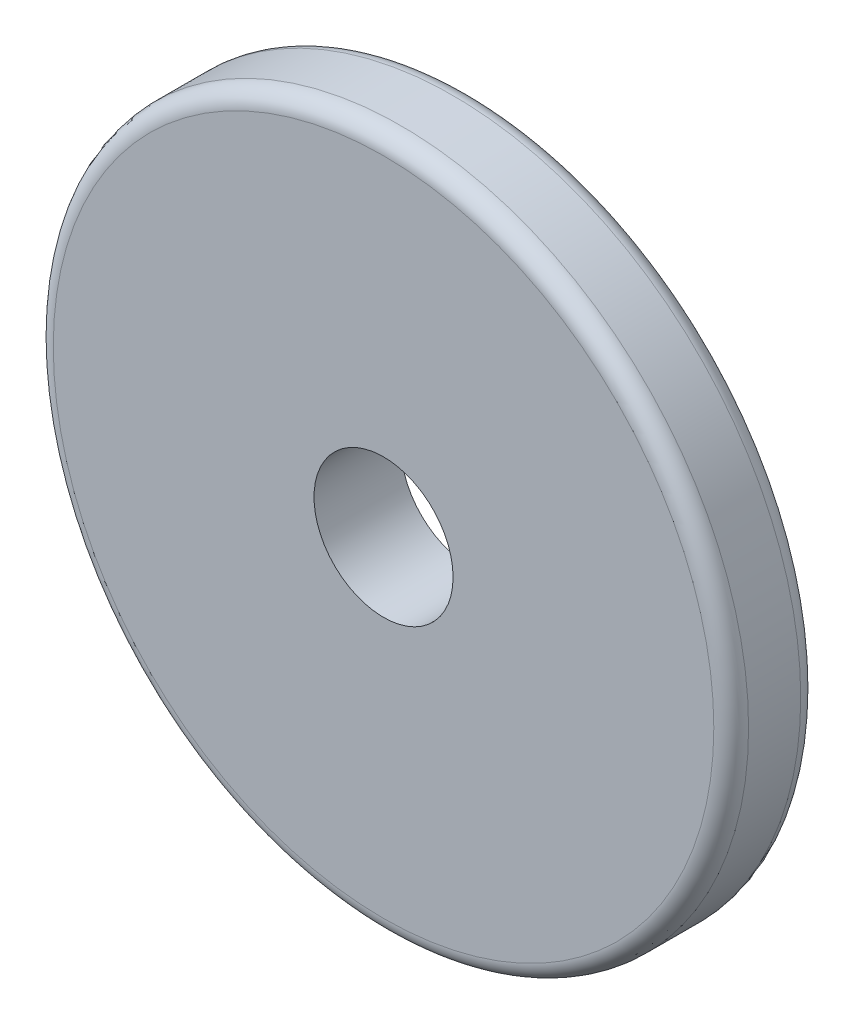
ISO-10303-21;
HEADER;
FILE_DESCRIPTION(('STEP AP214'),'2;1');
FILE_NAME('part.step','',(''),(''),'','','');
FILE_SCHEMA(('AUTOMOTIVE_DESIGN { 1 0 10303 214 1 1 1 1 }'));
ENDSEC;
DATA;
#1=APPLICATION_CONTEXT('core data for automotive mechanical design processes');
#2=APPLICATION_PROTOCOL_DEFINITION('international standard','automotive_design',2000,#1);
#3=PRODUCT_CONTEXT('',#1,'mechanical');
#4=PRODUCT('Part','Part','',(#3));
#5=PRODUCT_RELATED_PRODUCT_CATEGORY('part','',(#4));
#6=PRODUCT_DEFINITION_FORMATION('','',#4);
#7=PRODUCT_DEFINITION_CONTEXT('part definition',#1,'design');
#8=PRODUCT_DEFINITION('design','',#6,#7);
#9=PRODUCT_DEFINITION_SHAPE('','',#8);
#10=(LENGTH_UNIT() NAMED_UNIT(*) SI_UNIT(.MILLI.,.METRE.));
#11=(NAMED_UNIT(*) PLANE_ANGLE_UNIT() SI_UNIT($,.RADIAN.));
#12=(NAMED_UNIT(*) SI_UNIT($,.STERADIAN.) SOLID_ANGLE_UNIT());
#13=UNCERTAINTY_MEASURE_WITH_UNIT(LENGTH_MEASURE(1.E-05),#10,'distance_accuracy_value','');
#14=(GEOMETRIC_REPRESENTATION_CONTEXT(3) GLOBAL_UNCERTAINTY_ASSIGNED_CONTEXT((#13)) GLOBAL_UNIT_ASSIGNED_CONTEXT((#10,
#11,#12)) REPRESENTATION_CONTEXT('',''));
#15=CARTESIAN_POINT('',(0.,0.,0.));
#16=DIRECTION('',(0.,0.,1.));
#17=DIRECTION('',(1.,0.,0.));
#18=AXIS2_PLACEMENT_3D('',#15,#16,#17);
#19=CARTESIAN_POINT('',(0.,0.,5.));
#20=DIRECTION('',(0.,0.,1.));
#21=DIRECTION('',(1.,0.,0.));
#22=AXIS2_PLACEMENT_3D('',#19,#20,#21);
#23=PLANE('',#22);
#24=CARTESIAN_POINT('',(0.,0.,5.));
#25=DIRECTION('',(0.,0.,1.));
#26=DIRECTION('',(1.,0.,0.));
#27=AXIS2_PLACEMENT_3D('',#24,#25,#26);
#28=CIRCLE('',#27,19.);
#29=CARTESIAN_POINT('',(19.,0.,5.));
#30=VERTEX_POINT('',#29);
#31=EDGE_CURVE('E46',#30,#30,#28,.T.);
#32=ORIENTED_EDGE('',*,*,#31,.T.);
#33=EDGE_LOOP('',(#32));
#34=FACE_BOUND('',#33,.T.);
#35=CARTESIAN_POINT('',(0.,0.,5.));
#36=DIRECTION('',(0.,0.,1.));
#37=DIRECTION('',(1.,0.,0.));
#38=AXIS2_PLACEMENT_3D('',#35,#36,#37);
#39=CIRCLE('',#38,4.);
#40=CARTESIAN_POINT('',(4.,0.,5.));
#41=VERTEX_POINT('',#40);
#42=EDGE_CURVE('E51',#41,#41,#39,.T.);
#43=ORIENTED_EDGE('',*,*,#42,.F.);
#44=EDGE_LOOP('',(#43));
#45=FACE_BOUND('',#44,.T.);
#46=ADVANCED_FACE('F31',(#34,#45),#23,.T.);
#47=CARTESIAN_POINT('',(0.,0.,0.));
#48=DIRECTION('',(0.,0.,1.));
#49=DIRECTION('',(1.,0.,0.));
#50=AXIS2_PLACEMENT_3D('',#47,#48,#49);
#51=PLANE('',#50);
#52=CARTESIAN_POINT('',(0.,0.,0.));
#53=DIRECTION('',(0.,0.,1.));
#54=DIRECTION('',(1.,0.,0.));
#55=AXIS2_PLACEMENT_3D('',#52,#53,#54);
#56=CIRCLE('',#55,19.);
#57=CARTESIAN_POINT('',(19.,0.,0.));
#58=VERTEX_POINT('',#57);
#59=EDGE_CURVE('E10',#58,#58,#56,.F.);
#60=ORIENTED_EDGE('',*,*,#59,.T.);
#61=EDGE_LOOP('',(#60));
#62=FACE_BOUND('',#61,.T.);
#63=CARTESIAN_POINT('',(0.,0.,0.));
#64=DIRECTION('',(0.,0.,1.));
#65=DIRECTION('',(1.,0.,0.));
#66=AXIS2_PLACEMENT_3D('',#63,#64,#65);
#67=CIRCLE('',#66,4.);
#68=CARTESIAN_POINT('',(4.,0.,0.));
#69=VERTEX_POINT('',#68);
#70=EDGE_CURVE('E52',#69,#69,#67,.T.);
#71=ORIENTED_EDGE('',*,*,#70,.T.);
#72=EDGE_LOOP('',(#71));
#73=FACE_BOUND('',#72,.T.);
#74=ADVANCED_FACE('F62',(#62,#73),#51,.F.);
#75=CARTESIAN_POINT('',(0.,0.,5.));
#76=DIRECTION('',(0.,0.,-1.));
#77=DIRECTION('',(-1.,0.,0.));
#78=AXIS2_PLACEMENT_3D('',#75,#76,#77);
#79=CYLINDRICAL_SURFACE('',#78,20.);
#80=CARTESIAN_POINT('',(0.,0.,4.));
#81=DIRECTION('',(0.,0.,1.));
#82=DIRECTION('',(1.,0.,0.));
#83=AXIS2_PLACEMENT_3D('',#80,#81,#82);
#84=CIRCLE('',#83,20.);
#85=CARTESIAN_POINT('',(20.,0.,4.));
#86=VERTEX_POINT('',#85);
#87=EDGE_CURVE('E38',#86,#86,#84,.F.);
#88=ORIENTED_EDGE('',*,*,#87,.T.);
#89=EDGE_LOOP('',(#88));
#90=FACE_BOUND('',#89,.T.);
#91=CARTESIAN_POINT('',(0.,0.,1.));
#92=DIRECTION('',(0.,0.,1.));
#93=DIRECTION('',(1.,0.,0.));
#94=AXIS2_PLACEMENT_3D('',#91,#92,#93);
#95=CIRCLE('',#94,20.);
#96=CARTESIAN_POINT('',(20.,0.,1.));
#97=VERTEX_POINT('',#96);
#98=EDGE_CURVE('E42',#97,#97,#95,.T.);
#99=ORIENTED_EDGE('',*,*,#98,.T.);
#100=EDGE_LOOP('',(#99));
#101=FACE_BOUND('',#100,.T.);
#102=ADVANCED_FACE('F68',(#90,#101),#79,.T.);
#103=CARTESIAN_POINT('',(0.,0.,5.));
#104=DIRECTION('',(0.,0.,-1.));
#105=DIRECTION('',(-1.,0.,0.));
#106=AXIS2_PLACEMENT_3D('',#103,#104,#105);
#107=CYLINDRICAL_SURFACE('',#106,4.);
#108=ORIENTED_EDGE('',*,*,#42,.T.);
#109=EDGE_LOOP('',(#108));
#110=FACE_BOUND('',#109,.T.);
#111=ORIENTED_EDGE('',*,*,#70,.F.);
#112=EDGE_LOOP('',(#111));
#113=FACE_BOUND('',#112,.T.);
#114=ADVANCED_FACE('F58',(#110,#113),#107,.F.);
#115=CARTESIAN_POINT('',(0.,0.,4.));
#116=DIRECTION('',(0.,0.,1.));
#117=DIRECTION('',(1.,0.,0.));
#118=AXIS2_PLACEMENT_3D('',#115,#116,#117);
#119=TOROIDAL_SURFACE('',#118,19.,1.);
#120=ORIENTED_EDGE('',*,*,#87,.F.);
#121=EDGE_LOOP('',(#120));
#122=FACE_BOUND('',#121,.T.);
#123=ORIENTED_EDGE('',*,*,#31,.F.);
#124=EDGE_LOOP('',(#123));
#125=FACE_BOUND('',#124,.T.);
#126=ADVANCED_FACE('F73',(#122,#125),#119,.T.);
#127=CARTESIAN_POINT('',(0.,0.,1.));
#128=DIRECTION('',(0.,0.,1.));
#129=DIRECTION('',(1.,0.,0.));
#130=AXIS2_PLACEMENT_3D('',#127,#128,#129);
#131=TOROIDAL_SURFACE('',#130,19.,1.);
#132=ORIENTED_EDGE('',*,*,#59,.F.);
#133=EDGE_LOOP('',(#132));
#134=FACE_BOUND('',#133,.T.);
#135=ORIENTED_EDGE('',*,*,#98,.F.);
#136=EDGE_LOOP('',(#135));
#137=FACE_BOUND('',#136,.T.);
#138=ADVANCED_FACE('F33',(#134,#137),#131,.T.);
#139=CLOSED_SHELL('',(#46,#74,#102,#114,#126,#138));
#140=MANIFOLD_SOLID_BREP('B2',#139);
#141=ADVANCED_BREP_SHAPE_REPRESENTATION('',(#18,#140),#14);
#142=SHAPE_DEFINITION_REPRESENTATION(#9,#141);
ENDSEC;
END-ISO-10303-21;
